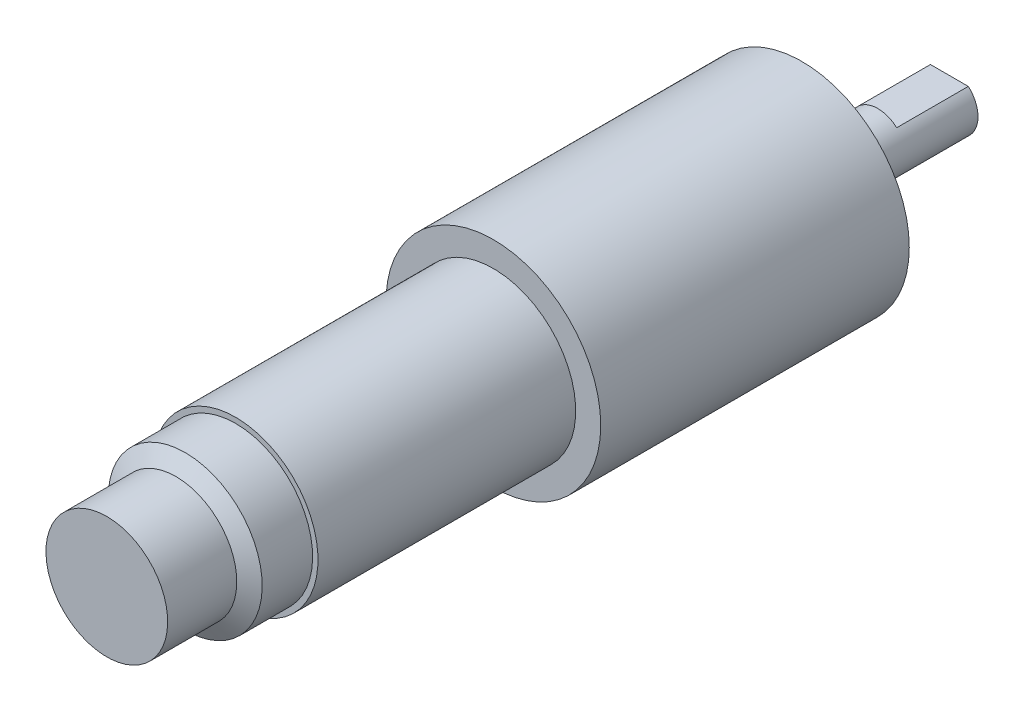
ISO-10303-21;
HEADER;
FILE_DESCRIPTION(('STEP AP214'),'2;1');
FILE_NAME('part.step','',(''),(''),'','','');
FILE_SCHEMA(('AUTOMOTIVE_DESIGN { 1 0 10303 214 1 1 1 1 }'));
ENDSEC;
DATA;
#1=APPLICATION_CONTEXT('core data for automotive mechanical design processes');
#2=APPLICATION_PROTOCOL_DEFINITION('international standard','automotive_design',2000,#1);
#3=PRODUCT_CONTEXT('',#1,'mechanical');
#4=PRODUCT('Part','Part','',(#3));
#5=PRODUCT_RELATED_PRODUCT_CATEGORY('part','',(#4));
#6=PRODUCT_DEFINITION_FORMATION('','',#4);
#7=PRODUCT_DEFINITION_CONTEXT('part definition',#1,'design');
#8=PRODUCT_DEFINITION('design','',#6,#7);
#9=PRODUCT_DEFINITION_SHAPE('','',#8);
#10=(LENGTH_UNIT() NAMED_UNIT(*) SI_UNIT(.MILLI.,.METRE.));
#11=(NAMED_UNIT(*) PLANE_ANGLE_UNIT() SI_UNIT($,.RADIAN.));
#12=(NAMED_UNIT(*) SI_UNIT($,.STERADIAN.) SOLID_ANGLE_UNIT());
#13=UNCERTAINTY_MEASURE_WITH_UNIT(LENGTH_MEASURE(1.E-05),#10,'distance_accuracy_value','');
#14=(GEOMETRIC_REPRESENTATION_CONTEXT(3) GLOBAL_UNCERTAINTY_ASSIGNED_CONTEXT((#13)) GLOBAL_UNIT_ASSIGNED_CONTEXT((#10,
#11,#12)) REPRESENTATION_CONTEXT('',''));
#15=CARTESIAN_POINT('',(0.,0.,0.));
#16=DIRECTION('',(0.,0.,1.));
#17=DIRECTION('',(1.,0.,0.));
#18=AXIS2_PLACEMENT_3D('',#15,#16,#17);
#19=CARTESIAN_POINT('',(0.,0.,86.146092564342));
#20=DIRECTION('',(0.,0.,-1.));
#21=DIRECTION('',(0.,1.,0.));
#22=AXIS2_PLACEMENT_3D('',#19,#20,#21);
#23=CONICAL_SURFACE('',#22,10.75,1.0471975511966);
#24=CARTESIAN_POINT('',(0.,0.,87.4451306700186));
#25=DIRECTION('',(0.,0.,-1.));
#26=DIRECTION('',(0.,1.,0.));
#27=AXIS2_PLACEMENT_3D('',#24,#25,#26);
#28=CIRCLE('',#27,8.5);
#29=CARTESIAN_POINT('',(0.,8.5,87.4451306700186));
#30=VERTEX_POINT('',#29);
#31=EDGE_CURVE('E56',#30,#30,#28,.T.);
#32=ORIENTED_EDGE('',*,*,#31,.T.);
#33=EDGE_LOOP('',(#32));
#34=FACE_BOUND('',#33,.T.);
#35=CARTESIAN_POINT('',(0.,0.,86.146092564342));
#36=DIRECTION('',(0.,0.,-1.));
#37=DIRECTION('',(0.,1.,0.));
#38=AXIS2_PLACEMENT_3D('',#35,#36,#37);
#39=CIRCLE('',#38,10.75);
#40=CARTESIAN_POINT('',(0.,10.75,86.146092564342));
#41=VERTEX_POINT('',#40);
#42=EDGE_CURVE('E11',#41,#41,#39,.T.);
#43=ORIENTED_EDGE('',*,*,#42,.F.);
#44=EDGE_LOOP('',(#43));
#45=FACE_BOUND('',#44,.T.);
#46=ADVANCED_FACE('F42',(#34,#45),#23,.T.);
#47=CARTESIAN_POINT('',(0.,0.,79.1));
#48=DIRECTION('',(0.,0.,-1.));
#49=DIRECTION('',(0.,1.,0.));
#50=AXIS2_PLACEMENT_3D('',#47,#48,#49);
#51=CYLINDRICAL_SURFACE('',#50,10.75);
#52=ORIENTED_EDGE('',*,*,#42,.T.);
#53=EDGE_LOOP('',(#52));
#54=FACE_BOUND('',#53,.T.);
#55=CARTESIAN_POINT('',(0.,0.,79.1));
#56=DIRECTION('',(0.,0.,-1.));
#57=DIRECTION('',(0.,1.,0.));
#58=AXIS2_PLACEMENT_3D('',#55,#56,#57);
#59=CIRCLE('',#58,10.75);
#60=CARTESIAN_POINT('',(0.,10.75,79.1));
#61=VERTEX_POINT('',#60);
#62=EDGE_CURVE('E48',#61,#61,#59,.T.);
#63=ORIENTED_EDGE('',*,*,#62,.F.);
#64=EDGE_LOOP('',(#63));
#65=FACE_BOUND('',#64,.T.);
#66=ADVANCED_FACE('F76',(#54,#65),#51,.T.);
#67=CARTESIAN_POINT('',(0.,10.75,79.1));
#68=DIRECTION('',(0.,0.,-1.));
#69=DIRECTION('',(0.,1.,0.));
#70=AXIS2_PLACEMENT_3D('',#67,#68,#69);
#71=PLANE('',#70);
#72=ORIENTED_EDGE('',*,*,#62,.T.);
#73=EDGE_LOOP('',(#72));
#74=FACE_BOUND('',#73,.T.);
#75=ADVANCED_FACE('F72',(#74),#71,.T.);
#76=CARTESIAN_POINT('',(0.,0.,97.1));
#77=DIRECTION('',(0.,0.,1.));
#78=DIRECTION('',(0.,-1.,0.));
#79=AXIS2_PLACEMENT_3D('',#76,#77,#78);
#80=PLANE('',#79);
#81=CARTESIAN_POINT('',(0.,0.,97.1));
#82=DIRECTION('',(0.,0.,-1.));
#83=DIRECTION('',(0.,1.,0.));
#84=AXIS2_PLACEMENT_3D('',#81,#82,#83);
#85=CIRCLE('',#84,8.5);
#86=CARTESIAN_POINT('',(0.,8.5,97.1));
#87=VERTEX_POINT('',#86);
#88=EDGE_CURVE('E52',#87,#87,#85,.T.);
#89=ORIENTED_EDGE('',*,*,#88,.F.);
#90=EDGE_LOOP('',(#89));
#91=FACE_BOUND('',#90,.T.);
#92=ADVANCED_FACE('F66',(#91),#80,.T.);
#93=CARTESIAN_POINT('',(0.,0.,79.1));
#94=DIRECTION('',(0.,0.,-1.));
#95=DIRECTION('',(0.,1.,0.));
#96=AXIS2_PLACEMENT_3D('',#93,#94,#95);
#97=CYLINDRICAL_SURFACE('',#96,8.5);
#98=ORIENTED_EDGE('',*,*,#88,.T.);
#99=EDGE_LOOP('',(#98));
#100=FACE_BOUND('',#99,.T.);
#101=ORIENTED_EDGE('',*,*,#31,.F.);
#102=EDGE_LOOP('',(#101));
#103=FACE_BOUND('',#102,.T.);
#104=ADVANCED_FACE('F64',(#100,#103),#97,.T.);
#105=CLOSED_SHELL('',(#46,#66,#75,#92,#104));
#106=MANIFOLD_SOLID_BREP('B2',#105);
#107=CARTESIAN_POINT('',(0.,0.,-20.6));
#108=DIRECTION('',(0.,0.,1.));
#109=DIRECTION('',(1.,0.,0.));
#110=AXIS2_PLACEMENT_3D('',#107,#108,#109);
#111=PLANE('',#110);
#112=CARTESIAN_POINT('',(0.,0.,-20.6));
#113=DIRECTION('',(0.,0.,1.));
#114=DIRECTION('',(1.,0.,0.));
#115=AXIS2_PLACEMENT_3D('',#112,#113,#114);
#116=CIRCLE('',#115,4.);
#117=CARTESIAN_POINT('',(-2.64575131106459,3.,-20.6));
#118=VERTEX_POINT('',#117);
#119=CARTESIAN_POINT('',(2.64575131106459,3.,-20.6));
#120=VERTEX_POINT('',#119);
#121=EDGE_CURVE('E40',#118,#120,#116,.T.);
#122=ORIENTED_EDGE('',*,*,#121,.F.);
#123=DIRECTION('',(-1.,0.,0.));
#124=VECTOR('',#123,1.);
#125=CARTESIAN_POINT('',(2.64575131106459,3.,-20.6));
#126=LINE('',#125,#124);
#127=EDGE_CURVE('E140',#120,#118,#126,.T.);
#128=ORIENTED_EDGE('',*,*,#127,.F.);
#129=EDGE_LOOP('',(#122,#128));
#130=FACE_BOUND('',#129,.T.);
#131=ADVANCED_FACE('F112',(#130),#111,.F.);
#132=CARTESIAN_POINT('',(0.,0.,0.));
#133=DIRECTION('',(0.,0.,1.));
#134=DIRECTION('',(1.,0.,0.));
#135=AXIS2_PLACEMENT_3D('',#132,#133,#134);
#136=CYLINDRICAL_SURFACE('',#135,4.);
#137=ORIENTED_EDGE('',*,*,#121,.T.);
#138=DIRECTION('',(0.,0.,-1.));
#139=VECTOR('',#138,1.);
#140=CARTESIAN_POINT('',(2.64575131106459,3.,-10.6));
#141=LINE('',#140,#139);
#142=CARTESIAN_POINT('',(2.64575131106459,3.,-10.6));
#143=VERTEX_POINT('',#142);
#144=EDGE_CURVE('E137',#143,#120,#141,.T.);
#145=ORIENTED_EDGE('',*,*,#144,.F.);
#146=CARTESIAN_POINT('',(0.,0.,-10.6));
#147=DIRECTION('',(0.,0.,-1.));
#148=DIRECTION('',(-1.,0.,0.));
#149=AXIS2_PLACEMENT_3D('',#146,#147,#148);
#150=CIRCLE('',#149,4.);
#151=CARTESIAN_POINT('',(-2.64575131106459,3.,-10.6));
#152=VERTEX_POINT('',#151);
#153=EDGE_CURVE('E130',#152,#143,#150,.T.);
#154=ORIENTED_EDGE('',*,*,#153,.F.);
#155=DIRECTION('',(0.,0.,-1.));
#156=VECTOR('',#155,1.);
#157=CARTESIAN_POINT('',(-2.64575131106459,3.,-10.6));
#158=LINE('',#157,#156);
#159=EDGE_CURVE('E143',#152,#118,#158,.T.);
#160=ORIENTED_EDGE('',*,*,#159,.T.);
#161=EDGE_LOOP('',(#137,#145,#154,#160));
#162=FACE_BOUND('',#161,.T.);
#163=CARTESIAN_POINT('',(0.,0.,-4.));
#164=DIRECTION('',(0.,0.,1.));
#165=DIRECTION('',(1.,0.,0.));
#166=AXIS2_PLACEMENT_3D('',#163,#164,#165);
#167=CIRCLE('',#166,4.);
#168=CARTESIAN_POINT('',(4.,0.,-4.));
#169=VERTEX_POINT('',#168);
#170=EDGE_CURVE('E119',#169,#169,#167,.T.);
#171=ORIENTED_EDGE('',*,*,#170,.F.);
#172=EDGE_LOOP('',(#171));
#173=FACE_BOUND('',#172,.T.);
#174=ADVANCED_FACE('F149',(#162,#173),#136,.T.);
#175=CARTESIAN_POINT('',(0.,4.,-4.));
#176=DIRECTION('',(0.,0.,1.));
#177=DIRECTION('',(1.,0.,0.));
#178=AXIS2_PLACEMENT_3D('',#175,#176,#177);
#179=PLANE('',#178);
#180=CARTESIAN_POINT('',(0.,0.,-4.));
#181=DIRECTION('',(0.,0.,1.));
#182=DIRECTION('',(1.,0.,0.));
#183=AXIS2_PLACEMENT_3D('',#180,#181,#182);
#184=CIRCLE('',#183,9.);
#185=CARTESIAN_POINT('',(9.,0.,-4.));
#186=VERTEX_POINT('',#185);
#187=EDGE_CURVE('E163',#186,#186,#184,.T.);
#188=ORIENTED_EDGE('',*,*,#187,.F.);
#189=EDGE_LOOP('',(#188));
#190=FACE_BOUND('',#189,.T.);
#191=ORIENTED_EDGE('',*,*,#170,.T.);
#192=EDGE_LOOP('',(#191));
#193=FACE_BOUND('',#192,.T.);
#194=ADVANCED_FACE('F168',(#190,#193),#179,.F.);
#195=CARTESIAN_POINT('',(0.,0.,0.));
#196=DIRECTION('',(0.,0.,1.));
#197=DIRECTION('',(1.,0.,0.));
#198=AXIS2_PLACEMENT_3D('',#195,#196,#197);
#199=CYLINDRICAL_SURFACE('',#198,9.);
#200=CARTESIAN_POINT('',(0.,0.,0.));
#201=DIRECTION('',(0.,0.,1.));
#202=DIRECTION('',(1.,0.,0.));
#203=AXIS2_PLACEMENT_3D('',#200,#201,#202);
#204=CIRCLE('',#203,9.);
#205=CARTESIAN_POINT('',(9.,0.,0.));
#206=VERTEX_POINT('',#205);
#207=EDGE_CURVE('E160',#206,#206,#204,.T.);
#208=ORIENTED_EDGE('',*,*,#207,.F.);
#209=EDGE_LOOP('',(#208));
#210=FACE_BOUND('',#209,.T.);
#211=ORIENTED_EDGE('',*,*,#187,.T.);
#212=EDGE_LOOP('',(#211));
#213=FACE_BOUND('',#212,.T.);
#214=ADVANCED_FACE('F174',(#210,#213),#199,.T.);
#215=CARTESIAN_POINT('',(0.,9.,0.));
#216=DIRECTION('',(0.,0.,1.));
#217=DIRECTION('',(1.,0.,0.));
#218=AXIS2_PLACEMENT_3D('',#215,#216,#217);
#219=PLANE('',#218);
#220=CARTESIAN_POINT('',(-13.,0.,0.));
#221=DIRECTION('',(0.,0.,-1.));
#222=DIRECTION('',(-1.,0.,0.));
#223=AXIS2_PLACEMENT_3D('',#220,#221,#222);
#224=CIRCLE('',#223,1.5);
#225=CARTESIAN_POINT('',(-14.5,0.,0.));
#226=VERTEX_POINT('',#225);
#227=EDGE_CURVE('E275',#226,#226,#224,.T.);
#228=ORIENTED_EDGE('',*,*,#227,.F.);
#229=EDGE_LOOP('',(#228));
#230=FACE_BOUND('',#229,.T.);
#231=CARTESIAN_POINT('',(0.,-13.,0.));
#232=DIRECTION('',(0.,0.,-1.));
#233=DIRECTION('',(-1.,0.,0.));
#234=AXIS2_PLACEMENT_3D('',#231,#232,#233);
#235=CIRCLE('',#234,1.5);
#236=CARTESIAN_POINT('',(-1.5,-13.,0.));
#237=VERTEX_POINT('',#236);
#238=EDGE_CURVE('E286',#237,#237,#235,.T.);
#239=ORIENTED_EDGE('',*,*,#238,.F.);
#240=EDGE_LOOP('',(#239));
#241=FACE_BOUND('',#240,.T.);
#242=CARTESIAN_POINT('',(13.,0.,0.));
#243=DIRECTION('',(0.,0.,-1.));
#244=DIRECTION('',(-1.,0.,0.));
#245=AXIS2_PLACEMENT_3D('',#242,#243,#244);
#246=CIRCLE('',#245,1.5);
#247=CARTESIAN_POINT('',(11.5,0.,0.));
#248=VERTEX_POINT('',#247);
#249=EDGE_CURVE('E292',#248,#248,#246,.T.);
#250=ORIENTED_EDGE('',*,*,#249,.F.);
#251=EDGE_LOOP('',(#250));
#252=FACE_BOUND('',#251,.T.);
#253=CARTESIAN_POINT('',(0.,13.,0.));
#254=DIRECTION('',(0.,0.,-1.));
#255=DIRECTION('',(-1.,0.,0.));
#256=AXIS2_PLACEMENT_3D('',#253,#254,#255);
#257=CIRCLE('',#256,1.5);
#258=CARTESIAN_POINT('',(-1.5,13.,0.));
#259=VERTEX_POINT('',#258);
#260=EDGE_CURVE('E274',#259,#259,#257,.T.);
#261=ORIENTED_EDGE('',*,*,#260,.F.);
#262=EDGE_LOOP('',(#261));
#263=FACE_BOUND('',#262,.T.);
#264=CARTESIAN_POINT('',(0.,0.,0.));
#265=DIRECTION('',(0.,0.,1.));
#266=DIRECTION('',(1.,0.,0.));
#267=AXIS2_PLACEMENT_3D('',#264,#265,#266);
#268=CIRCLE('',#267,15.);
#269=CARTESIAN_POINT('',(15.,0.,0.));
#270=VERTEX_POINT('',#269);
#271=EDGE_CURVE('E154',#270,#270,#268,.T.);
#272=ORIENTED_EDGE('',*,*,#271,.F.);
#273=EDGE_LOOP('',(#272));
#274=FACE_BOUND('',#273,.T.);
#275=ORIENTED_EDGE('',*,*,#207,.T.);
#276=EDGE_LOOP('',(#275));
#277=FACE_BOUND('',#276,.T.);
#278=ADVANCED_FACE('F180',(#230,#241,#252,#263,#274,#277),#219,.F.);
#279=CARTESIAN_POINT('',(0.,0.,0.));
#280=DIRECTION('',(0.,0.,1.));
#281=DIRECTION('',(1.,0.,0.));
#282=AXIS2_PLACEMENT_3D('',#279,#280,#281);
#283=CYLINDRICAL_SURFACE('',#282,15.);
#284=CARTESIAN_POINT('',(0.,0.,43.1));
#285=DIRECTION('',(0.,0.,1.));
#286=DIRECTION('',(1.,0.,0.));
#287=AXIS2_PLACEMENT_3D('',#284,#285,#286);
#288=CIRCLE('',#287,15.);
#289=CARTESIAN_POINT('',(15.,0.,43.1));
#290=VERTEX_POINT('',#289);
#291=EDGE_CURVE('E151',#290,#290,#288,.T.);
#292=ORIENTED_EDGE('',*,*,#291,.F.);
#293=EDGE_LOOP('',(#292));
#294=FACE_BOUND('',#293,.T.);
#295=ORIENTED_EDGE('',*,*,#271,.T.);
#296=EDGE_LOOP('',(#295));
#297=FACE_BOUND('',#296,.T.);
#298=ADVANCED_FACE('F184',(#294,#297),#283,.T.);
#299=CARTESIAN_POINT('',(0.,15.,43.1));
#300=DIRECTION('',(0.,0.,-1.));
#301=DIRECTION('',(-1.,0.,0.));
#302=AXIS2_PLACEMENT_3D('',#299,#300,#301);
#303=PLANE('',#302);
#304=CARTESIAN_POINT('',(0.,0.,43.1));
#305=DIRECTION('',(0.,0.,-1.));
#306=DIRECTION('',(-1.,0.,0.));
#307=AXIS2_PLACEMENT_3D('',#304,#305,#306);
#308=CIRCLE('',#307,11.5);
#309=CARTESIAN_POINT('',(-11.5,0.,43.1));
#310=VERTEX_POINT('',#309);
#311=EDGE_CURVE('E296',#310,#310,#308,.T.);
#312=ORIENTED_EDGE('',*,*,#311,.T.);
#313=EDGE_LOOP('',(#312));
#314=FACE_BOUND('',#313,.T.);
#315=ORIENTED_EDGE('',*,*,#291,.T.);
#316=EDGE_LOOP('',(#315));
#317=FACE_BOUND('',#316,.T.);
#318=ADVANCED_FACE('F188',(#314,#317),#303,.F.);
#319=CARTESIAN_POINT('',(2.64575131106459,3.,-10.6));
#320=DIRECTION('',(0.,-1.,0.));
#321=DIRECTION('',(0.,0.,-1.));
#322=AXIS2_PLACEMENT_3D('',#319,#320,#321);
#323=PLANE('',#322);
#324=ORIENTED_EDGE('',*,*,#127,.T.);
#325=ORIENTED_EDGE('',*,*,#159,.F.);
#326=DIRECTION('',(-1.,0.,0.));
#327=VECTOR('',#326,1.);
#328=CARTESIAN_POINT('',(2.64575131106459,3.,-10.6));
#329=LINE('',#328,#327);
#330=EDGE_CURVE('E125',#143,#152,#329,.T.);
#331=ORIENTED_EDGE('',*,*,#330,.F.);
#332=ORIENTED_EDGE('',*,*,#144,.T.);
#333=EDGE_LOOP('',(#324,#325,#331,#332));
#334=FACE_BOUND('',#333,.T.);
#335=ADVANCED_FACE('F139',(#334),#323,.F.);
#336=CARTESIAN_POINT('',(0.,0.,-10.6));
#337=DIRECTION('',(0.,0.,-1.));
#338=DIRECTION('',(-1.,0.,0.));
#339=AXIS2_PLACEMENT_3D('',#336,#337,#338);
#340=PLANE('',#339);
#341=ORIENTED_EDGE('',*,*,#153,.T.);
#342=ORIENTED_EDGE('',*,*,#330,.T.);
#343=EDGE_LOOP('',(#341,#342));
#344=FACE_BOUND('',#343,.T.);
#345=ADVANCED_FACE('F195',(#344),#340,.T.);
#346=CARTESIAN_POINT('',(0.,1.49999999999999,93.9));
#347=DIRECTION('',(0.,0.,1.));
#348=DIRECTION('',(1.,0.,0.));
#349=AXIS2_PLACEMENT_3D('',#346,#347,#348);
#350=PLANE('',#349);
#351=CARTESIAN_POINT('',(0.,0.,93.9));
#352=DIRECTION('',(0.,0.,-1.));
#353=DIRECTION('',(-1.,0.,0.));
#354=AXIS2_PLACEMENT_3D('',#351,#352,#353);
#355=CIRCLE('',#354,1.49999999999999);
#356=CARTESIAN_POINT('',(-1.49999999999999,0.,93.9));
#357=VERTEX_POINT('',#356);
#358=EDGE_CURVE('E147',#357,#357,#355,.T.);
#359=ORIENTED_EDGE('',*,*,#358,.F.);
#360=EDGE_LOOP('',(#359));
#361=FACE_BOUND('',#360,.T.);
#362=ADVANCED_FACE('F198',(#361),#350,.T.);
#363=CARTESIAN_POINT('',(0.,0.,0.));
#364=DIRECTION('',(0.,0.,-1.));
#365=DIRECTION('',(-1.,0.,0.));
#366=AXIS2_PLACEMENT_3D('',#363,#364,#365);
#367=CYLINDRICAL_SURFACE('',#366,1.49999999999999);
#368=ORIENTED_EDGE('',*,*,#358,.T.);
#369=EDGE_LOOP('',(#368));
#370=FACE_BOUND('',#369,.T.);
#371=CARTESIAN_POINT('',(0.,0.,88.2));
#372=DIRECTION('',(0.,0.,-1.));
#373=DIRECTION('',(-1.,0.,0.));
#374=AXIS2_PLACEMENT_3D('',#371,#372,#373);
#375=CIRCLE('',#374,1.49999999999999);
#376=CARTESIAN_POINT('',(-1.49999999999999,0.,88.2));
#377=VERTEX_POINT('',#376);
#378=EDGE_CURVE('E321',#377,#377,#375,.T.);
#379=ORIENTED_EDGE('',*,*,#378,.F.);
#380=EDGE_LOOP('',(#379));
#381=FACE_BOUND('',#380,.T.);
#382=ADVANCED_FACE('F201',(#370,#381),#367,.T.);
#383=CARTESIAN_POINT('',(0.,1.49999999999999,88.2));
#384=DIRECTION('',(0.,0.,1.));
#385=DIRECTION('',(1.,0.,0.));
#386=AXIS2_PLACEMENT_3D('',#383,#384,#385);
#387=PLANE('',#386);
#388=ORIENTED_EDGE('',*,*,#378,.T.);
#389=EDGE_LOOP('',(#388));
#390=FACE_BOUND('',#389,.T.);
#391=CARTESIAN_POINT('',(0.,0.,88.2));
#392=DIRECTION('',(0.,0.,-1.));
#393=DIRECTION('',(-1.,0.,0.));
#394=AXIS2_PLACEMENT_3D('',#391,#392,#393);
#395=CIRCLE('',#394,2.99999999999999);
#396=CARTESIAN_POINT('',(-2.99999999999999,0.,88.2));
#397=VERTEX_POINT('',#396);
#398=EDGE_CURVE('E318',#397,#397,#395,.T.);
#399=ORIENTED_EDGE('',*,*,#398,.F.);
#400=EDGE_LOOP('',(#399));
#401=FACE_BOUND('',#400,.T.);
#402=ADVANCED_FACE('F205',(#390,#401),#387,.T.);
#403=CARTESIAN_POINT('',(0.,0.,0.));
#404=DIRECTION('',(0.,0.,-1.));
#405=DIRECTION('',(-1.,0.,0.));
#406=AXIS2_PLACEMENT_3D('',#403,#404,#405);
#407=CYLINDRICAL_SURFACE('',#406,2.99999999999999);
#408=ORIENTED_EDGE('',*,*,#398,.T.);
#409=EDGE_LOOP('',(#408));
#410=FACE_BOUND('',#409,.T.);
#411=CARTESIAN_POINT('',(0.,0.,86.6));
#412=DIRECTION('',(0.,0.,-1.));
#413=DIRECTION('',(-1.,0.,0.));
#414=AXIS2_PLACEMENT_3D('',#411,#412,#413);
#415=CIRCLE('',#414,2.99999999999999);
#416=CARTESIAN_POINT('',(-2.99999999999999,0.,86.6));
#417=VERTEX_POINT('',#416);
#418=EDGE_CURVE('E315',#417,#417,#415,.T.);
#419=ORIENTED_EDGE('',*,*,#418,.F.);
#420=EDGE_LOOP('',(#419));
#421=FACE_BOUND('',#420,.T.);
#422=ADVANCED_FACE('F209',(#410,#421),#407,.T.);
#423=CARTESIAN_POINT('',(0.,4.49999999999999,86.6));
#424=DIRECTION('',(0.,0.,1.));
#425=DIRECTION('',(1.,0.,0.));
#426=AXIS2_PLACEMENT_3D('',#423,#424,#425);
#427=PLANE('',#426);
#428=ORIENTED_EDGE('',*,*,#418,.T.);
#429=EDGE_LOOP('',(#428));
#430=FACE_BOUND('',#429,.T.);
#431=CARTESIAN_POINT('',(0.,0.,86.6));
#432=DIRECTION('',(0.,0.,-1.));
#433=DIRECTION('',(-1.,0.,0.));
#434=AXIS2_PLACEMENT_3D('',#431,#432,#433);
#435=CIRCLE('',#434,4.49999999999999);
#436=CARTESIAN_POINT('',(-4.49999999999999,0.,86.6));
#437=VERTEX_POINT('',#436);
#438=EDGE_CURVE('E312',#437,#437,#435,.T.);
#439=ORIENTED_EDGE('',*,*,#438,.F.);
#440=EDGE_LOOP('',(#439));
#441=FACE_BOUND('',#440,.T.);
#442=ADVANCED_FACE('F213',(#430,#441),#427,.T.);
#443=CARTESIAN_POINT('',(0.,0.,0.));
#444=DIRECTION('',(0.,0.,-1.));
#445=DIRECTION('',(-1.,0.,0.));
#446=AXIS2_PLACEMENT_3D('',#443,#444,#445);
#447=CYLINDRICAL_SURFACE('',#446,4.49999999999999);
#448=ORIENTED_EDGE('',*,*,#438,.T.);
#449=EDGE_LOOP('',(#448));
#450=FACE_BOUND('',#449,.T.);
#451=CARTESIAN_POINT('',(0.,0.,85.1));
#452=DIRECTION('',(0.,0.,-1.));
#453=DIRECTION('',(-1.,0.,0.));
#454=AXIS2_PLACEMENT_3D('',#451,#452,#453);
#455=CIRCLE('',#454,4.49999999999999);
#456=CARTESIAN_POINT('',(-4.49999999999999,0.,85.1));
#457=VERTEX_POINT('',#456);
#458=EDGE_CURVE('E309',#457,#457,#455,.T.);
#459=ORIENTED_EDGE('',*,*,#458,.F.);
#460=EDGE_LOOP('',(#459));
#461=FACE_BOUND('',#460,.T.);
#462=ADVANCED_FACE('F217',(#450,#461),#447,.T.);
#463=CARTESIAN_POINT('',(0.,4.49999999999999,85.1));
#464=DIRECTION('',(0.,0.,1.));
#465=DIRECTION('',(1.,0.,0.));
#466=AXIS2_PLACEMENT_3D('',#463,#464,#465);
#467=PLANE('',#466);
#468=ORIENTED_EDGE('',*,*,#458,.T.);
#469=EDGE_LOOP('',(#468));
#470=FACE_BOUND('',#469,.T.);
#471=CARTESIAN_POINT('',(0.,0.,85.1));
#472=DIRECTION('',(0.,0.,-1.));
#473=DIRECTION('',(-1.,0.,0.));
#474=AXIS2_PLACEMENT_3D('',#471,#472,#473);
#475=CIRCLE('',#474,10.5);
#476=CARTESIAN_POINT('',(-10.5,0.,85.1));
#477=VERTEX_POINT('',#476);
#478=EDGE_CURVE('E306',#477,#477,#475,.T.);
#479=ORIENTED_EDGE('',*,*,#478,.F.);
#480=EDGE_LOOP('',(#479));
#481=FACE_BOUND('',#480,.T.);
#482=ADVANCED_FACE('F221',(#470,#481),#467,.T.);
#483=CARTESIAN_POINT('',(0.,0.,0.));
#484=DIRECTION('',(0.,0.,-1.));
#485=DIRECTION('',(-1.,0.,0.));
#486=AXIS2_PLACEMENT_3D('',#483,#484,#485);
#487=CYLINDRICAL_SURFACE('',#486,10.5);
#488=ORIENTED_EDGE('',*,*,#478,.T.);
#489=EDGE_LOOP('',(#488));
#490=FACE_BOUND('',#489,.T.);
#491=CARTESIAN_POINT('',(0.,0.,79.1));
#492=DIRECTION('',(0.,0.,-1.));
#493=DIRECTION('',(-1.,0.,0.));
#494=AXIS2_PLACEMENT_3D('',#491,#492,#493);
#495=CIRCLE('',#494,10.5);
#496=CARTESIAN_POINT('',(-10.5,0.,79.1));
#497=VERTEX_POINT('',#496);
#498=EDGE_CURVE('E303',#497,#497,#495,.T.);
#499=ORIENTED_EDGE('',*,*,#498,.F.);
#500=EDGE_LOOP('',(#499));
#501=FACE_BOUND('',#500,.T.);
#502=ADVANCED_FACE('F225',(#490,#501),#487,.T.);
#503=CARTESIAN_POINT('',(0.,11.5,79.1));
#504=DIRECTION('',(0.,0.,1.));
#505=DIRECTION('',(1.,0.,0.));
#506=AXIS2_PLACEMENT_3D('',#503,#504,#505);
#507=PLANE('',#506);
#508=ORIENTED_EDGE('',*,*,#498,.T.);
#509=EDGE_LOOP('',(#508));
#510=FACE_BOUND('',#509,.T.);
#511=CARTESIAN_POINT('',(0.,0.,79.1));
#512=DIRECTION('',(0.,0.,-1.));
#513=DIRECTION('',(-1.,0.,0.));
#514=AXIS2_PLACEMENT_3D('',#511,#512,#513);
#515=CIRCLE('',#514,11.5);
#516=CARTESIAN_POINT('',(-11.5,0.,79.1));
#517=VERTEX_POINT('',#516);
#518=EDGE_CURVE('E300',#517,#517,#515,.T.);
#519=ORIENTED_EDGE('',*,*,#518,.F.);
#520=EDGE_LOOP('',(#519));
#521=FACE_BOUND('',#520,.T.);
#522=ADVANCED_FACE('F229',(#510,#521),#507,.T.);
#523=CARTESIAN_POINT('',(0.,0.,0.));
#524=DIRECTION('',(0.,0.,-1.));
#525=DIRECTION('',(-1.,0.,0.));
#526=AXIS2_PLACEMENT_3D('',#523,#524,#525);
#527=CYLINDRICAL_SURFACE('',#526,11.5);
#528=ORIENTED_EDGE('',*,*,#518,.T.);
#529=EDGE_LOOP('',(#528));
#530=FACE_BOUND('',#529,.T.);
#531=ORIENTED_EDGE('',*,*,#311,.F.);
#532=EDGE_LOOP('',(#531));
#533=FACE_BOUND('',#532,.T.);
#534=ADVANCED_FACE('F233',(#530,#533),#527,.T.);
#535=CARTESIAN_POINT('',(0.,13.,4.));
#536=DIRECTION('',(0.,0.,-1.));
#537=DIRECTION('',(-1.,0.,0.));
#538=AXIS2_PLACEMENT_3D('',#535,#536,#537);
#539=CYLINDRICAL_SURFACE('',#538,1.5);
#540=CARTESIAN_POINT('',(0.,13.,4.));
#541=DIRECTION('',(0.,0.,-1.));
#542=DIRECTION('',(-1.,0.,0.));
#543=AXIS2_PLACEMENT_3D('',#540,#541,#542);
#544=CIRCLE('',#543,1.5);
#545=CARTESIAN_POINT('',(-1.5,13.,4.));
#546=VERTEX_POINT('',#545);
#547=EDGE_CURVE('E278',#546,#546,#544,.T.);
#548=ORIENTED_EDGE('',*,*,#547,.F.);
#549=EDGE_LOOP('',(#548));
#550=FACE_BOUND('',#549,.T.);
#551=ORIENTED_EDGE('',*,*,#260,.T.);
#552=EDGE_LOOP('',(#551));
#553=FACE_BOUND('',#552,.T.);
#554=ADVANCED_FACE('F237',(#550,#553),#539,.F.);
#555=CARTESIAN_POINT('',(0.,13.,4.));
#556=DIRECTION('',(0.,0.,-1.));
#557=DIRECTION('',(-1.,0.,0.));
#558=AXIS2_PLACEMENT_3D('',#555,#556,#557);
#559=PLANE('',#558);
#560=ORIENTED_EDGE('',*,*,#547,.T.);
#561=EDGE_LOOP('',(#560));
#562=FACE_BOUND('',#561,.T.);
#563=ADVANCED_FACE('F241',(#562),#559,.T.);
#564=CARTESIAN_POINT('',(13.,0.,4.));
#565=DIRECTION('',(0.,0.,-1.));
#566=DIRECTION('',(-1.,0.,0.));
#567=AXIS2_PLACEMENT_3D('',#564,#565,#566);
#568=CYLINDRICAL_SURFACE('',#567,1.5);
#569=CARTESIAN_POINT('',(13.,0.,4.));
#570=DIRECTION('',(0.,0.,-1.));
#571=DIRECTION('',(-1.,0.,0.));
#572=AXIS2_PLACEMENT_3D('',#569,#570,#571);
#573=CIRCLE('',#572,1.5);
#574=CARTESIAN_POINT('',(11.5,0.,4.));
#575=VERTEX_POINT('',#574);
#576=EDGE_CURVE('E289',#575,#575,#573,.T.);
#577=ORIENTED_EDGE('',*,*,#576,.F.);
#578=EDGE_LOOP('',(#577));
#579=FACE_BOUND('',#578,.T.);
#580=ORIENTED_EDGE('',*,*,#249,.T.);
#581=EDGE_LOOP('',(#580));
#582=FACE_BOUND('',#581,.T.);
#583=ADVANCED_FACE('F245',(#579,#582),#568,.F.);
#584=CARTESIAN_POINT('',(13.,0.,4.));
#585=DIRECTION('',(0.,0.,-1.));
#586=DIRECTION('',(-1.,0.,0.));
#587=AXIS2_PLACEMENT_3D('',#584,#585,#586);
#588=PLANE('',#587);
#589=ORIENTED_EDGE('',*,*,#576,.T.);
#590=EDGE_LOOP('',(#589));
#591=FACE_BOUND('',#590,.T.);
#592=ADVANCED_FACE('F249',(#591),#588,.T.);
#593=CARTESIAN_POINT('',(0.,-13.,4.));
#594=DIRECTION('',(0.,0.,-1.));
#595=DIRECTION('',(-1.,0.,0.));
#596=AXIS2_PLACEMENT_3D('',#593,#594,#595);
#597=CYLINDRICAL_SURFACE('',#596,1.5);
#598=CARTESIAN_POINT('',(0.,-13.,4.));
#599=DIRECTION('',(0.,0.,-1.));
#600=DIRECTION('',(-1.,0.,0.));
#601=AXIS2_PLACEMENT_3D('',#598,#599,#600);
#602=CIRCLE('',#601,1.5);
#603=CARTESIAN_POINT('',(-1.5,-13.,4.));
#604=VERTEX_POINT('',#603);
#605=EDGE_CURVE('E281',#604,#604,#602,.T.);
#606=ORIENTED_EDGE('',*,*,#605,.F.);
#607=EDGE_LOOP('',(#606));
#608=FACE_BOUND('',#607,.T.);
#609=ORIENTED_EDGE('',*,*,#238,.T.);
#610=EDGE_LOOP('',(#609));
#611=FACE_BOUND('',#610,.T.);
#612=ADVANCED_FACE('F253',(#608,#611),#597,.F.);
#613=CARTESIAN_POINT('',(0.,-13.,4.));
#614=DIRECTION('',(0.,0.,-1.));
#615=DIRECTION('',(-1.,0.,0.));
#616=AXIS2_PLACEMENT_3D('',#613,#614,#615);
#617=PLANE('',#616);
#618=ORIENTED_EDGE('',*,*,#605,.T.);
#619=EDGE_LOOP('',(#618));
#620=FACE_BOUND('',#619,.T.);
#621=ADVANCED_FACE('F257',(#620),#617,.T.);
#622=CARTESIAN_POINT('',(-13.,0.,4.));
#623=DIRECTION('',(0.,0.,-1.));
#624=DIRECTION('',(-1.,0.,0.));
#625=AXIS2_PLACEMENT_3D('',#622,#623,#624);
#626=CYLINDRICAL_SURFACE('',#625,1.5);
#627=CARTESIAN_POINT('',(-13.,0.,4.));
#628=DIRECTION('',(0.,0.,-1.));
#629=DIRECTION('',(-1.,0.,0.));
#630=AXIS2_PLACEMENT_3D('',#627,#628,#629);
#631=CIRCLE('',#630,1.5);
#632=CARTESIAN_POINT('',(-14.5,0.,4.));
#633=VERTEX_POINT('',#632);
#634=EDGE_CURVE('E273',#633,#633,#631,.T.);
#635=ORIENTED_EDGE('',*,*,#634,.F.);
#636=EDGE_LOOP('',(#635));
#637=FACE_BOUND('',#636,.T.);
#638=ORIENTED_EDGE('',*,*,#227,.T.);
#639=EDGE_LOOP('',(#638));
#640=FACE_BOUND('',#639,.T.);
#641=ADVANCED_FACE('F261',(#637,#640),#626,.F.);
#642=CARTESIAN_POINT('',(-13.,0.,4.));
#643=DIRECTION('',(0.,0.,-1.));
#644=DIRECTION('',(-1.,0.,0.));
#645=AXIS2_PLACEMENT_3D('',#642,#643,#644);
#646=PLANE('',#645);
#647=ORIENTED_EDGE('',*,*,#634,.T.);
#648=EDGE_LOOP('',(#647));
#649=FACE_BOUND('',#648,.T.);
#650=ADVANCED_FACE('F265',(#649),#646,.T.);
#651=CLOSED_SHELL('',(#131,#174,#194,#214,#278,#298,#318,#335,#345,#362,#382,#402,#422,#442,
#462,#482,#502,#522,#534,#554,#563,#583,#592,#612,#621,#641,#650));
#652=MANIFOLD_SOLID_BREP('B6',#651);
#653=ADVANCED_BREP_SHAPE_REPRESENTATION('',(#18,#106,#652),#14);
#654=SHAPE_DEFINITION_REPRESENTATION(#9,#653);
ENDSEC;
END-ISO-10303-21;
